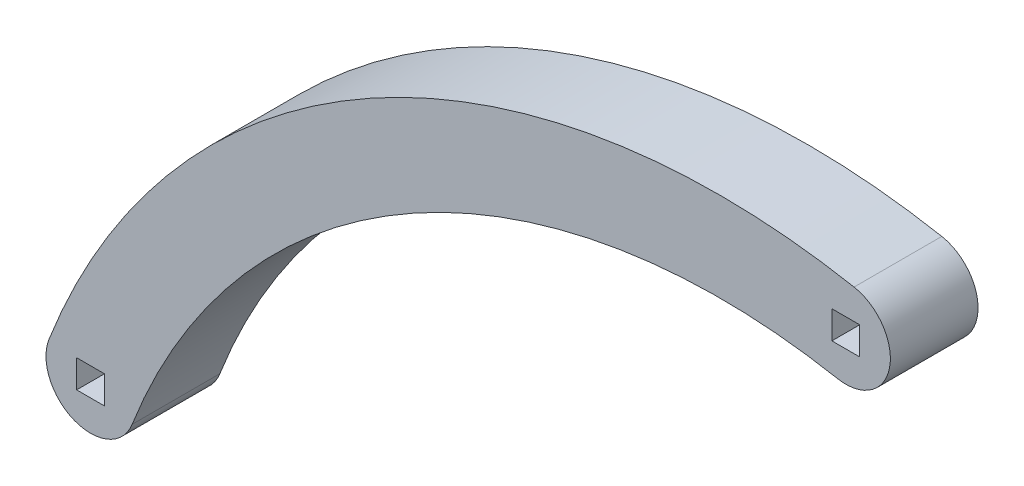
ISO-10303-21;
HEADER;
FILE_DESCRIPTION(('STEP AP214'),'2;1');
FILE_NAME('part.step','',(''),(''),'','','');
FILE_SCHEMA(('AUTOMOTIVE_DESIGN { 1 0 10303 214 1 1 1 1 }'));
ENDSEC;
DATA;
#1=APPLICATION_CONTEXT('core data for automotive mechanical design processes');
#2=APPLICATION_PROTOCOL_DEFINITION('international standard','automotive_design',2000,#1);
#3=PRODUCT_CONTEXT('',#1,'mechanical');
#4=PRODUCT('Part','Part','',(#3));
#5=PRODUCT_RELATED_PRODUCT_CATEGORY('part','',(#4));
#6=PRODUCT_DEFINITION_FORMATION('','',#4);
#7=PRODUCT_DEFINITION_CONTEXT('part definition',#1,'design');
#8=PRODUCT_DEFINITION('design','',#6,#7);
#9=PRODUCT_DEFINITION_SHAPE('','',#8);
#10=(LENGTH_UNIT() NAMED_UNIT(*) SI_UNIT(.MILLI.,.METRE.));
#11=(NAMED_UNIT(*) PLANE_ANGLE_UNIT() SI_UNIT($,.RADIAN.));
#12=(NAMED_UNIT(*) SI_UNIT($,.STERADIAN.) SOLID_ANGLE_UNIT());
#13=UNCERTAINTY_MEASURE_WITH_UNIT(LENGTH_MEASURE(1.E-05),#10,'distance_accuracy_value','');
#14=(GEOMETRIC_REPRESENTATION_CONTEXT(3) GLOBAL_UNCERTAINTY_ASSIGNED_CONTEXT((#13)) GLOBAL_UNIT_ASSIGNED_CONTEXT((#10,
#11,#12)) REPRESENTATION_CONTEXT('',''));
#15=CARTESIAN_POINT('',(0.,0.,0.));
#16=DIRECTION('',(0.,0.,1.));
#17=DIRECTION('',(1.,0.,0.));
#18=AXIS2_PLACEMENT_3D('',#15,#16,#17);
#19=CARTESIAN_POINT('',(78.9542934124698,10.071011815298,10.));
#20=DIRECTION('',(0.,0.,1.));
#21=DIRECTION('',(1.,0.,0.));
#22=AXIS2_PLACEMENT_3D('',#19,#20,#21);
#23=PLANE('',#22);
#24=CARTESIAN_POINT('',(86.1043652630546,47.8908048607085,10.));
#25=DIRECTION('',(0.,0.,1.));
#26=DIRECTION('',(1.,0.,0.));
#27=AXIS2_PLACEMENT_3D('',#24,#25,#26);
#28=CIRCLE('',#27,5.08000000000002);
#29=CARTESIAN_POINT('',(85.1606757838881,42.8992269371549,10.));
#30=VERTEX_POINT('',#29);
#31=CARTESIAN_POINT('',(87.0480547422211,52.8823827842625,10.));
#32=VERTEX_POINT('',#31);
#33=EDGE_CURVE('E231',#30,#32,#28,.T.);
#34=ORIENTED_EDGE('',*,*,#33,.T.);
#35=CARTESIAN_POINT('',(71.8042215618847,-27.7487812301127,10.));
#36=DIRECTION('',(0.,0.,1.));
#37=DIRECTION('',(1.,0.,0.));
#38=AXIS2_PLACEMENT_3D('',#35,#36,#37);
#39=CIRCLE('',#38,82.0594848895788);
#40=CARTESIAN_POINT('',(-4.73847605056876,1.83118669670485,9.99999999999998));
#41=VERTEX_POINT('',#40);
#42=EDGE_CURVE('E235',#32,#41,#39,.T.);
#43=ORIENTED_EDGE('',*,*,#42,.T.);
#44=CARTESIAN_POINT('',(0.,0.,10.));
#45=DIRECTION('',(0.,0.,1.));
#46=DIRECTION('',(1.,0.,0.));
#47=AXIS2_PLACEMENT_3D('',#44,#45,#46);
#48=CIRCLE('',#47,5.08000000000001);
#49=CARTESIAN_POINT('',(4.73847605056832,-1.83118669670451,9.99999999999926));
#50=VERTEX_POINT('',#49);
#51=EDGE_CURVE('E239',#41,#50,#48,.T.);
#52=ORIENTED_EDGE('',*,*,#51,.T.);
#53=CARTESIAN_POINT('',(71.8042215618847,-27.7487812301127,10.));
#54=DIRECTION('',(0.,0.,-1.));
#55=DIRECTION('',(1.,0.,0.));
#56=AXIS2_PLACEMENT_3D('',#53,#54,#55);
#57=CIRCLE('',#56,71.8994848895788);
#58=EDGE_CURVE('E242',#50,#30,#57,.T.);
#59=ORIENTED_EDGE('',*,*,#58,.T.);
#60=EDGE_LOOP('',(#34,#43,#52,#59));
#61=FACE_BOUND('',#60,.T.);
#62=DIRECTION('',(-1.,0.,0.));
#63=VECTOR('',#62,1.);
#64=CARTESIAN_POINT('',(-1.58749999999996,1.58750000000013,10.));
#65=LINE('',#64,#63);
#66=CARTESIAN_POINT('',(1.5875000000003,1.58750000000035,9.99999999999998));
#67=VERTEX_POINT('',#66);
#68=CARTESIAN_POINT('',(-1.58749999999996,1.58750000000013,10.));
#69=VERTEX_POINT('',#68);
#70=EDGE_CURVE('E191',#67,#69,#65,.T.);
#71=ORIENTED_EDGE('',*,*,#70,.F.);
#72=DIRECTION('',(0.,1.,0.));
#73=VECTOR('',#72,1.);
#74=CARTESIAN_POINT('',(1.58749999999996,-1.58749999999999,10.));
#75=LINE('',#74,#73);
#76=CARTESIAN_POINT('',(1.58749999999996,-1.58749999999999,10.));
#77=VERTEX_POINT('',#76);
#78=EDGE_CURVE('E188',#77,#67,#75,.T.);
#79=ORIENTED_EDGE('',*,*,#78,.F.);
#80=DIRECTION('',(1.,0.,0.));
#81=VECTOR('',#80,1.);
#82=CARTESIAN_POINT('',(-1.58749999999996,-1.58749999999996,9.99999999999926));
#83=LINE('',#82,#81);
#84=CARTESIAN_POINT('',(-1.58749999999996,-1.58749999999996,9.99999999999926));
#85=VERTEX_POINT('',#84);
#86=EDGE_CURVE('E199',#85,#77,#83,.T.);
#87=ORIENTED_EDGE('',*,*,#86,.F.);
#88=DIRECTION('',(0.,-1.,0.));
#89=VECTOR('',#88,1.);
#90=CARTESIAN_POINT('',(-1.58749999999996,-1.58749999999996,9.99999999999926));
#91=LINE('',#90,#89);
#92=EDGE_CURVE('E195',#69,#85,#91,.T.);
#93=ORIENTED_EDGE('',*,*,#92,.F.);
#94=EDGE_LOOP('',(#71,#79,#87,#93));
#95=FACE_BOUND('',#94,.T.);
#96=DIRECTION('',(-1.,0.,0.));
#97=VECTOR('',#96,1.);
#98=CARTESIAN_POINT('',(84.5168652630547,49.4783048607085,10.));
#99=LINE('',#98,#97);
#100=CARTESIAN_POINT('',(87.6918652630548,49.4783048607087,9.99999999999998));
#101=VERTEX_POINT('',#100);
#102=CARTESIAN_POINT('',(84.5168652630547,49.4783048607085,10.));
#103=VERTEX_POINT('',#102);
#104=EDGE_CURVE('E148',#101,#103,#99,.T.);
#105=ORIENTED_EDGE('',*,*,#104,.F.);
#106=DIRECTION('',(0.,1.,0.));
#107=VECTOR('',#106,1.);
#108=CARTESIAN_POINT('',(87.6918652630547,46.3033048607086,10.));
#109=LINE('',#108,#107);
#110=CARTESIAN_POINT('',(87.6918652630547,46.3033048607086,10.));
#111=VERTEX_POINT('',#110);
#112=EDGE_CURVE('E139',#111,#101,#109,.T.);
#113=ORIENTED_EDGE('',*,*,#112,.F.);
#114=DIRECTION('',(1.,0.,0.));
#115=VECTOR('',#114,1.);
#116=CARTESIAN_POINT('',(84.5168652630547,46.3033048607086,9.99999999999926));
#117=LINE('',#116,#115);
#118=CARTESIAN_POINT('',(84.5168652630547,46.3033048607086,9.99999999999926));
#119=VERTEX_POINT('',#118);
#120=EDGE_CURVE('E166',#119,#111,#117,.T.);
#121=ORIENTED_EDGE('',*,*,#120,.F.);
#122=DIRECTION('',(0.,-1.,0.));
#123=VECTOR('',#122,1.);
#124=CARTESIAN_POINT('',(84.5168652630547,46.3033048607086,9.99999999999926));
#125=LINE('',#124,#123);
#126=EDGE_CURVE('E161',#103,#119,#125,.T.);
#127=ORIENTED_EDGE('',*,*,#126,.F.);
#128=EDGE_LOOP('',(#105,#113,#121,#127));
#129=FACE_BOUND('',#128,.T.);
#130=ADVANCED_FACE('F49',(#61,#95,#129),#23,.T.);
#131=CARTESIAN_POINT('',(78.9542934124697,10.0710118152979,0.));
#132=DIRECTION('',(0.,0.,1.));
#133=DIRECTION('',(1.,0.,0.));
#134=AXIS2_PLACEMENT_3D('',#131,#132,#133);
#135=PLANE('',#134);
#136=DIRECTION('',(0.,1.,0.));
#137=VECTOR('',#136,1.);
#138=CARTESIAN_POINT('',(1.58749999999985,-1.58749999999988,0.));
#139=LINE('',#138,#137);
#140=CARTESIAN_POINT('',(1.58749999999985,-1.58749999999988,0.));
#141=VERTEX_POINT('',#140);
#142=CARTESIAN_POINT('',(1.58749999999996,1.58750000000002,0.));
#143=VERTEX_POINT('',#142);
#144=EDGE_CURVE('E157',#141,#143,#139,.T.);
#145=ORIENTED_EDGE('',*,*,#144,.T.);
#146=DIRECTION('',(-1.,0.,0.));
#147=VECTOR('',#146,1.);
#148=CARTESIAN_POINT('',(-1.58749999999996,1.58750000000005,0.));
#149=LINE('',#148,#147);
#150=CARTESIAN_POINT('',(-1.58749999999996,1.58750000000005,0.));
#151=VERTEX_POINT('',#150);
#152=EDGE_CURVE('E206',#143,#151,#149,.T.);
#153=ORIENTED_EDGE('',*,*,#152,.T.);
#154=DIRECTION('',(0.,-1.,0.));
#155=VECTOR('',#154,1.);
#156=CARTESIAN_POINT('',(-1.58750000000007,-1.58749999999991,-7.49400541621981E-13));
#157=LINE('',#156,#155);
#158=CARTESIAN_POINT('',(-1.58750000000007,-1.58749999999991,-7.49400541621981E-13));
#159=VERTEX_POINT('',#158);
#160=EDGE_CURVE('E210',#151,#159,#157,.T.);
#161=ORIENTED_EDGE('',*,*,#160,.T.);
#162=DIRECTION('',(1.,0.,0.));
#163=VECTOR('',#162,1.);
#164=CARTESIAN_POINT('',(-1.58750000000007,-1.58749999999991,-7.49400541621981E-13));
#165=LINE('',#164,#163);
#166=EDGE_CURVE('E192',#159,#141,#165,.T.);
#167=ORIENTED_EDGE('',*,*,#166,.T.);
#168=EDGE_LOOP('',(#145,#153,#161,#167));
#169=FACE_BOUND('',#168,.T.);
#170=CARTESIAN_POINT('',(86.1043652630546,47.8908048607086,0.));
#171=DIRECTION('',(0.,0.,1.));
#172=DIRECTION('',(1.,0.,0.));
#173=AXIS2_PLACEMENT_3D('',#170,#171,#172);
#174=CIRCLE('',#173,5.08000000000002);
#175=CARTESIAN_POINT('',(85.1606757838883,42.8992269371548,0.));
#176=VERTEX_POINT('',#175);
#177=CARTESIAN_POINT('',(87.048054742221,52.8823827842625,0.));
#178=VERTEX_POINT('',#177);
#179=EDGE_CURVE('E230',#176,#178,#174,.T.);
#180=ORIENTED_EDGE('',*,*,#179,.F.);
#181=CARTESIAN_POINT('',(71.8042215618846,-27.7487812301128,0.));
#182=DIRECTION('',(0.,0.,-1.));
#183=DIRECTION('',(1.,0.,0.));
#184=AXIS2_PLACEMENT_3D('',#181,#182,#183);
#185=CIRCLE('',#184,71.8994848895788);
#186=CARTESIAN_POINT('',(4.7384760505681,-1.83118669670446,-7.49400541621981E-13));
#187=VERTEX_POINT('',#186);
#188=EDGE_CURVE('E236',#187,#176,#185,.T.);
#189=ORIENTED_EDGE('',*,*,#188,.F.);
#190=CARTESIAN_POINT('',(0.,0.,0.));
#191=DIRECTION('',(0.,0.,1.));
#192=DIRECTION('',(1.,0.,0.));
#193=AXIS2_PLACEMENT_3D('',#190,#191,#192);
#194=CIRCLE('',#193,5.08000000000001);
#195=CARTESIAN_POINT('',(-4.73847605056865,1.83118669670471,0.));
#196=VERTEX_POINT('',#195);
#197=EDGE_CURVE('E252',#196,#187,#194,.T.);
#198=ORIENTED_EDGE('',*,*,#197,.F.);
#199=CARTESIAN_POINT('',(71.8042215618846,-27.7487812301128,0.));
#200=DIRECTION('',(0.,0.,1.));
#201=DIRECTION('',(1.,0.,0.));
#202=AXIS2_PLACEMENT_3D('',#199,#200,#201);
#203=CIRCLE('',#202,82.0594848895788);
#204=EDGE_CURVE('E249',#178,#196,#203,.T.);
#205=ORIENTED_EDGE('',*,*,#204,.F.);
#206=EDGE_LOOP('',(#180,#189,#198,#205));
#207=FACE_BOUND('',#206,.T.);
#208=DIRECTION('',(0.,1.,0.));
#209=VECTOR('',#208,1.);
#210=CARTESIAN_POINT('',(87.6918652630545,46.3033048607087,0.));
#211=LINE('',#210,#209);
#212=CARTESIAN_POINT('',(87.6918652630545,46.3033048607087,0.));
#213=VERTEX_POINT('',#212);
#214=CARTESIAN_POINT('',(87.6918652630546,49.4783048607088,-7.49400541621981E-13));
#215=VERTEX_POINT('',#214);
#216=EDGE_CURVE('E73',#213,#215,#211,.T.);
#217=ORIENTED_EDGE('',*,*,#216,.T.);
#218=DIRECTION('',(-1.,0.,0.));
#219=VECTOR('',#218,1.);
#220=CARTESIAN_POINT('',(84.5168652630546,49.4783048607086,0.));
#221=LINE('',#220,#219);
#222=CARTESIAN_POINT('',(84.5168652630546,49.4783048607086,0.));
#223=VERTEX_POINT('',#222);
#224=EDGE_CURVE('E155',#215,#223,#221,.T.);
#225=ORIENTED_EDGE('',*,*,#224,.T.);
#226=DIRECTION('',(0.,-1.,0.));
#227=VECTOR('',#226,1.);
#228=CARTESIAN_POINT('',(84.5168652630547,46.3033048607087,-7.49400541621981E-13));
#229=LINE('',#228,#227);
#230=CARTESIAN_POINT('',(84.5168652630547,46.3033048607087,-7.49400541621981E-13));
#231=VERTEX_POINT('',#230);
#232=EDGE_CURVE('E175',#223,#231,#229,.T.);
#233=ORIENTED_EDGE('',*,*,#232,.T.);
#234=DIRECTION('',(1.,0.,0.));
#235=VECTOR('',#234,1.);
#236=CARTESIAN_POINT('',(84.5168652630547,46.3033048607087,-7.49400541621981E-13));
#237=LINE('',#236,#235);
#238=EDGE_CURVE('E149',#231,#213,#237,.T.);
#239=ORIENTED_EDGE('',*,*,#238,.T.);
#240=EDGE_LOOP('',(#217,#225,#233,#239));
#241=FACE_BOUND('',#240,.T.);
#242=ADVANCED_FACE('F276',(#169,#207,#241),#135,.F.);
#243=CARTESIAN_POINT('',(86.1043652630546,47.8908048607085,10.));
#244=DIRECTION('',(0.,0.,-1.));
#245=DIRECTION('',(-1.,0.,0.));
#246=AXIS2_PLACEMENT_3D('',#243,#244,#245);
#247=CYLINDRICAL_SURFACE('',#246,5.08000000000002);
#248=ORIENTED_EDGE('',*,*,#179,.T.);
#249=DIRECTION('',(0.,0.,-1.));
#250=VECTOR('',#249,1.);
#251=CARTESIAN_POINT('',(87.0480547422211,52.8823827842625,10.));
#252=LINE('',#251,#250);
#253=EDGE_CURVE('E13',#32,#178,#252,.T.);
#254=ORIENTED_EDGE('',*,*,#253,.F.);
#255=ORIENTED_EDGE('',*,*,#33,.F.);
#256=DIRECTION('',(0.,0.,-1.));
#257=VECTOR('',#256,1.);
#258=CARTESIAN_POINT('',(85.1606757838881,42.8992269371549,10.));
#259=LINE('',#258,#257);
#260=EDGE_CURVE('E245',#30,#176,#259,.T.);
#261=ORIENTED_EDGE('',*,*,#260,.T.);
#262=EDGE_LOOP('',(#248,#254,#255,#261));
#263=FACE_BOUND('',#262,.T.);
#264=ADVANCED_FACE('F51',(#263),#247,.T.);
#265=CARTESIAN_POINT('',(71.8042215618847,-27.7487812301127,10.));
#266=DIRECTION('',(0.,0.,-1.));
#267=DIRECTION('',(-1.,0.,0.));
#268=AXIS2_PLACEMENT_3D('',#265,#266,#267);
#269=CYLINDRICAL_SURFACE('',#268,82.0594848895788);
#270=ORIENTED_EDGE('',*,*,#204,.T.);
#271=DIRECTION('',(0.,0.,-1.));
#272=VECTOR('',#271,1.);
#273=CARTESIAN_POINT('',(-4.73847605056876,1.83118669670485,9.99999999999998));
#274=LINE('',#273,#272);
#275=EDGE_CURVE('E58',#41,#196,#274,.T.);
#276=ORIENTED_EDGE('',*,*,#275,.F.);
#277=ORIENTED_EDGE('',*,*,#42,.F.);
#278=ORIENTED_EDGE('',*,*,#253,.T.);
#279=EDGE_LOOP('',(#270,#276,#277,#278));
#280=FACE_BOUND('',#279,.T.);
#281=ADVANCED_FACE('F287',(#280),#269,.T.);
#282=CARTESIAN_POINT('',(0.,0.,10.));
#283=DIRECTION('',(0.,0.,-1.));
#284=DIRECTION('',(-1.,0.,0.));
#285=AXIS2_PLACEMENT_3D('',#282,#283,#284);
#286=CYLINDRICAL_SURFACE('',#285,5.08000000000001);
#287=ORIENTED_EDGE('',*,*,#197,.T.);
#288=DIRECTION('',(0.,0.,-1.));
#289=VECTOR('',#288,1.);
#290=CARTESIAN_POINT('',(4.73847605056832,-1.83118669670451,9.99999999999926));
#291=LINE('',#290,#289);
#292=EDGE_CURVE('E260',#50,#187,#291,.T.);
#293=ORIENTED_EDGE('',*,*,#292,.F.);
#294=ORIENTED_EDGE('',*,*,#51,.F.);
#295=ORIENTED_EDGE('',*,*,#275,.T.);
#296=EDGE_LOOP('',(#287,#293,#294,#295));
#297=FACE_BOUND('',#296,.T.);
#298=ADVANCED_FACE('F270',(#297),#286,.T.);
#299=CARTESIAN_POINT('',(71.8042215618847,-27.7487812301127,10.));
#300=DIRECTION('',(0.,0.,-1.));
#301=DIRECTION('',(-1.,0.,0.));
#302=AXIS2_PLACEMENT_3D('',#299,#300,#301);
#303=CYLINDRICAL_SURFACE('',#302,71.8994848895788);
#304=ORIENTED_EDGE('',*,*,#188,.T.);
#305=ORIENTED_EDGE('',*,*,#260,.F.);
#306=ORIENTED_EDGE('',*,*,#58,.F.);
#307=ORIENTED_EDGE('',*,*,#292,.T.);
#308=EDGE_LOOP('',(#304,#305,#306,#307));
#309=FACE_BOUND('',#308,.T.);
#310=ADVANCED_FACE('F280',(#309),#303,.F.);
#311=CARTESIAN_POINT('',(1.58749999999996,-1.58749999999999,10.));
#312=DIRECTION('',(-1.,0.,0.));
#313=DIRECTION('',(0.,0.,1.));
#314=AXIS2_PLACEMENT_3D('',#311,#312,#313);
#315=PLANE('',#314);
#316=ORIENTED_EDGE('',*,*,#144,.F.);
#317=DIRECTION('',(0.,0.,-1.));
#318=VECTOR('',#317,1.);
#319=CARTESIAN_POINT('',(1.58749999999996,-1.58749999999999,10.));
#320=LINE('',#319,#318);
#321=EDGE_CURVE('E202',#77,#141,#320,.T.);
#322=ORIENTED_EDGE('',*,*,#321,.F.);
#323=ORIENTED_EDGE('',*,*,#78,.T.);
#324=DIRECTION('',(0.,0.,-1.));
#325=VECTOR('',#324,1.);
#326=CARTESIAN_POINT('',(1.5875000000003,1.58750000000035,9.99999999999998));
#327=LINE('',#326,#325);
#328=EDGE_CURVE('E226',#67,#143,#327,.T.);
#329=ORIENTED_EDGE('',*,*,#328,.T.);
#330=EDGE_LOOP('',(#316,#322,#323,#329));
#331=FACE_BOUND('',#330,.T.);
#332=ADVANCED_FACE('F302',(#331),#315,.T.);
#333=CARTESIAN_POINT('',(-1.58749999999996,1.58750000000013,10.));
#334=DIRECTION('',(0.,-1.,0.));
#335=DIRECTION('',(0.,0.,-1.));
#336=AXIS2_PLACEMENT_3D('',#333,#334,#335);
#337=PLANE('',#336);
#338=ORIENTED_EDGE('',*,*,#152,.F.);
#339=ORIENTED_EDGE('',*,*,#328,.F.);
#340=ORIENTED_EDGE('',*,*,#70,.T.);
#341=DIRECTION('',(0.,0.,-1.));
#342=VECTOR('',#341,1.);
#343=CARTESIAN_POINT('',(-1.58749999999996,1.58750000000013,10.));
#344=LINE('',#343,#342);
#345=EDGE_CURVE('E223',#69,#151,#344,.T.);
#346=ORIENTED_EDGE('',*,*,#345,.T.);
#347=EDGE_LOOP('',(#338,#339,#340,#346));
#348=FACE_BOUND('',#347,.T.);
#349=ADVANCED_FACE('F309',(#348),#337,.T.);
#350=CARTESIAN_POINT('',(-1.58749999999996,-1.58749999999996,9.99999999999926));
#351=DIRECTION('',(1.,0.,0.));
#352=DIRECTION('',(0.,0.,-1.));
#353=AXIS2_PLACEMENT_3D('',#350,#351,#352);
#354=PLANE('',#353);
#355=ORIENTED_EDGE('',*,*,#160,.F.);
#356=ORIENTED_EDGE('',*,*,#345,.F.);
#357=ORIENTED_EDGE('',*,*,#92,.T.);
#358=DIRECTION('',(0.,0.,-1.));
#359=VECTOR('',#358,1.);
#360=CARTESIAN_POINT('',(-1.58749999999996,-1.58749999999996,9.99999999999926));
#361=LINE('',#360,#359);
#362=EDGE_CURVE('E220',#85,#159,#361,.T.);
#363=ORIENTED_EDGE('',*,*,#362,.T.);
#364=EDGE_LOOP('',(#355,#356,#357,#363));
#365=FACE_BOUND('',#364,.T.);
#366=ADVANCED_FACE('F314',(#365),#354,.T.);
#367=CARTESIAN_POINT('',(-1.58749999999996,-1.58749999999996,9.99999999999926));
#368=DIRECTION('',(0.,1.,0.));
#369=DIRECTION('',(0.,0.,1.));
#370=AXIS2_PLACEMENT_3D('',#367,#368,#369);
#371=PLANE('',#370);
#372=ORIENTED_EDGE('',*,*,#166,.F.);
#373=ORIENTED_EDGE('',*,*,#362,.F.);
#374=ORIENTED_EDGE('',*,*,#86,.T.);
#375=ORIENTED_EDGE('',*,*,#321,.T.);
#376=EDGE_LOOP('',(#372,#373,#374,#375));
#377=FACE_BOUND('',#376,.T.);
#378=ADVANCED_FACE('F321',(#377),#371,.T.);
#379=CARTESIAN_POINT('',(87.6918652630547,46.3033048607086,10.));
#380=DIRECTION('',(-1.,0.,0.));
#381=DIRECTION('',(0.,0.,1.));
#382=AXIS2_PLACEMENT_3D('',#379,#380,#381);
#383=PLANE('',#382);
#384=ORIENTED_EDGE('',*,*,#216,.F.);
#385=DIRECTION('',(0.,0.,-1.));
#386=VECTOR('',#385,1.);
#387=CARTESIAN_POINT('',(87.6918652630547,46.3033048607086,10.));
#388=LINE('',#387,#386);
#389=EDGE_CURVE('E143',#111,#213,#388,.T.);
#390=ORIENTED_EDGE('',*,*,#389,.F.);
#391=ORIENTED_EDGE('',*,*,#112,.T.);
#392=DIRECTION('',(0.,0.,-1.));
#393=VECTOR('',#392,1.);
#394=CARTESIAN_POINT('',(87.6918652630548,49.4783048607087,9.99999999999998));
#395=LINE('',#394,#393);
#396=EDGE_CURVE('E142',#101,#215,#395,.T.);
#397=ORIENTED_EDGE('',*,*,#396,.T.);
#398=EDGE_LOOP('',(#384,#390,#391,#397));
#399=FACE_BOUND('',#398,.T.);
#400=ADVANCED_FACE('F141',(#399),#383,.T.);
#401=CARTESIAN_POINT('',(84.5168652630547,49.4783048607085,10.));
#402=DIRECTION('',(0.,-1.,0.));
#403=DIRECTION('',(0.,0.,-1.));
#404=AXIS2_PLACEMENT_3D('',#401,#402,#403);
#405=PLANE('',#404);
#406=ORIENTED_EDGE('',*,*,#224,.F.);
#407=ORIENTED_EDGE('',*,*,#396,.F.);
#408=ORIENTED_EDGE('',*,*,#104,.T.);
#409=DIRECTION('',(0.,0.,-1.));
#410=VECTOR('',#409,1.);
#411=CARTESIAN_POINT('',(84.5168652630547,49.4783048607085,10.));
#412=LINE('',#411,#410);
#413=EDGE_CURVE('E158',#103,#223,#412,.T.);
#414=ORIENTED_EDGE('',*,*,#413,.T.);
#415=EDGE_LOOP('',(#406,#407,#408,#414));
#416=FACE_BOUND('',#415,.T.);
#417=ADVANCED_FACE('F152',(#416),#405,.T.);
#418=CARTESIAN_POINT('',(84.5168652630547,46.3033048607086,9.99999999999926));
#419=DIRECTION('',(1.,0.,0.));
#420=DIRECTION('',(0.,0.,-1.));
#421=AXIS2_PLACEMENT_3D('',#418,#419,#420);
#422=PLANE('',#421);
#423=ORIENTED_EDGE('',*,*,#232,.F.);
#424=ORIENTED_EDGE('',*,*,#413,.F.);
#425=ORIENTED_EDGE('',*,*,#126,.T.);
#426=DIRECTION('',(0.,0.,-1.));
#427=VECTOR('',#426,1.);
#428=CARTESIAN_POINT('',(84.5168652630547,46.3033048607086,9.99999999999926));
#429=LINE('',#428,#427);
#430=EDGE_CURVE('E65',#119,#231,#429,.T.);
#431=ORIENTED_EDGE('',*,*,#430,.T.);
#432=EDGE_LOOP('',(#423,#424,#425,#431));
#433=FACE_BOUND('',#432,.T.);
#434=ADVANCED_FACE('F339',(#433),#422,.T.);
#435=CARTESIAN_POINT('',(84.5168652630547,46.3033048607086,9.99999999999926));
#436=DIRECTION('',(0.,1.,0.));
#437=DIRECTION('',(0.,0.,1.));
#438=AXIS2_PLACEMENT_3D('',#435,#436,#437);
#439=PLANE('',#438);
#440=ORIENTED_EDGE('',*,*,#238,.F.);
#441=ORIENTED_EDGE('',*,*,#430,.F.);
#442=ORIENTED_EDGE('',*,*,#120,.T.);
#443=ORIENTED_EDGE('',*,*,#389,.T.);
#444=EDGE_LOOP('',(#440,#441,#442,#443));
#445=FACE_BOUND('',#444,.T.);
#446=ADVANCED_FACE('F342',(#445),#439,.T.);
#447=CLOSED_SHELL('',(#130,#242,#264,#281,#298,#310,#332,#349,#366,#378,#400,#417,#434,#446));
#448=MANIFOLD_SOLID_BREP('B2',#447);
#449=ADVANCED_BREP_SHAPE_REPRESENTATION('',(#18,#448),#14);
#450=SHAPE_DEFINITION_REPRESENTATION(#9,#449);
ENDSEC;
END-ISO-10303-21;
